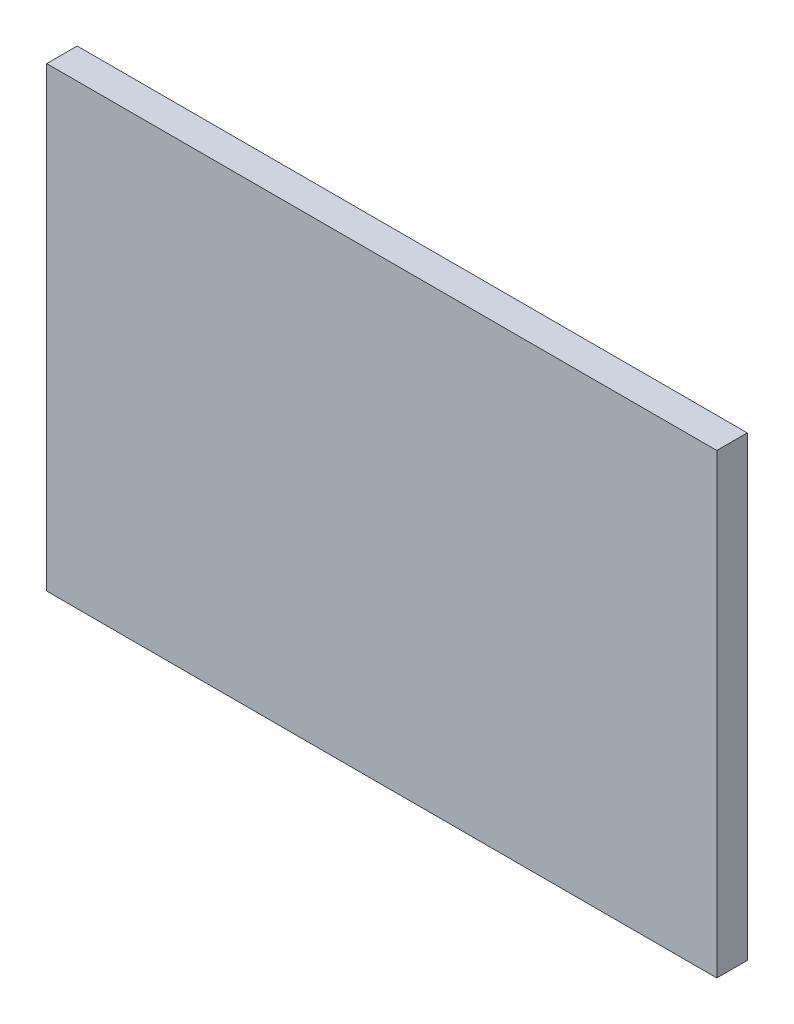
ISO-10303-21;
HEADER;
FILE_DESCRIPTION(('STEP AP214'),'2;1');
FILE_NAME('part.step','',(''),(''),'','','');
FILE_SCHEMA(('AUTOMOTIVE_DESIGN { 1 0 10303 214 1 1 1 1 }'));
ENDSEC;
DATA;
#1=APPLICATION_CONTEXT('core data for automotive mechanical design processes');
#2=APPLICATION_PROTOCOL_DEFINITION('international standard','automotive_design',2000,#1);
#3=PRODUCT_CONTEXT('',#1,'mechanical');
#4=PRODUCT('Part','Part','',(#3));
#5=PRODUCT_RELATED_PRODUCT_CATEGORY('part','',(#4));
#6=PRODUCT_DEFINITION_FORMATION('','',#4);
#7=PRODUCT_DEFINITION_CONTEXT('part definition',#1,'design');
#8=PRODUCT_DEFINITION('design','',#6,#7);
#9=PRODUCT_DEFINITION_SHAPE('','',#8);
#10=(LENGTH_UNIT() NAMED_UNIT(*) SI_UNIT(.MILLI.,.METRE.));
#11=(NAMED_UNIT(*) PLANE_ANGLE_UNIT() SI_UNIT($,.RADIAN.));
#12=(NAMED_UNIT(*) SI_UNIT($,.STERADIAN.) SOLID_ANGLE_UNIT());
#13=UNCERTAINTY_MEASURE_WITH_UNIT(LENGTH_MEASURE(1.E-05),#10,'distance_accuracy_value','');
#14=(GEOMETRIC_REPRESENTATION_CONTEXT(3) GLOBAL_UNCERTAINTY_ASSIGNED_CONTEXT((#13)) GLOBAL_UNIT_ASSIGNED_CONTEXT((#10,
#11,#12)) REPRESENTATION_CONTEXT('',''));
#15=CARTESIAN_POINT('',(0.,0.,0.));
#16=DIRECTION('',(0.,0.,1.));
#17=DIRECTION('',(1.,0.,0.));
#18=AXIS2_PLACEMENT_3D('',#15,#16,#17);
#19=CARTESIAN_POINT('',(15446.9936196928,15869.1368853616,1000.));
#20=DIRECTION('',(1.,0.,0.));
#21=DIRECTION('',(0.,0.,-1.));
#22=AXIS2_PLACEMENT_3D('',#19,#20,#21);
#23=PLANE('',#22);
#24=DIRECTION('',(0.,-1.,0.));
#25=VECTOR('',#24,1.);
#26=CARTESIAN_POINT('',(15446.9936196928,15869.1368853616,0.));
#27=LINE('',#26,#25);
#28=CARTESIAN_POINT('',(15446.9936196928,15869.1368853616,0.));
#29=VERTEX_POINT('',#28);
#30=CARTESIAN_POINT('',(15446.9936196928,869.136885361596,0.));
#31=VERTEX_POINT('',#30);
#32=EDGE_CURVE('E100',#29,#31,#27,.T.);
#33=ORIENTED_EDGE('',*,*,#32,.T.);
#34=DIRECTION('',(0.,0.,-1.));
#35=VECTOR('',#34,1.);
#36=CARTESIAN_POINT('',(15446.9936196928,869.136885361596,1000.));
#37=LINE('',#36,#35);
#38=CARTESIAN_POINT('',(15446.9936196928,869.136885361596,1000.));
#39=VERTEX_POINT('',#38);
#40=EDGE_CURVE('E11',#39,#31,#37,.T.);
#41=ORIENTED_EDGE('',*,*,#40,.F.);
#42=DIRECTION('',(0.,-1.,0.));
#43=VECTOR('',#42,1.);
#44=CARTESIAN_POINT('',(15446.9936196928,15869.1368853616,1000.));
#45=LINE('',#44,#43);
#46=CARTESIAN_POINT('',(15446.9936196928,15869.1368853616,1000.));
#47=VERTEX_POINT('',#46);
#48=EDGE_CURVE('E86',#47,#39,#45,.T.);
#49=ORIENTED_EDGE('',*,*,#48,.F.);
#50=DIRECTION('',(0.,0.,-1.));
#51=VECTOR('',#50,1.);
#52=CARTESIAN_POINT('',(15446.9936196928,15869.1368853616,1000.));
#53=LINE('',#52,#51);
#54=EDGE_CURVE('E53',#47,#29,#53,.T.);
#55=ORIENTED_EDGE('',*,*,#54,.T.);
#56=EDGE_LOOP('',(#33,#41,#49,#55));
#57=FACE_BOUND('',#56,.T.);
#58=ADVANCED_FACE('F37',(#57),#23,.F.);
#59=CARTESIAN_POINT('',(15446.9936196928,869.136885361596,1000.));
#60=DIRECTION('',(0.,1.,0.));
#61=DIRECTION('',(0.,0.,1.));
#62=AXIS2_PLACEMENT_3D('',#59,#60,#61);
#63=PLANE('',#62);
#64=DIRECTION('',(1.,0.,0.));
#65=VECTOR('',#64,1.);
#66=CARTESIAN_POINT('',(15446.9936196928,869.136885361596,0.));
#67=LINE('',#66,#65);
#68=CARTESIAN_POINT('',(37446.9936196928,869.136885361596,0.));
#69=VERTEX_POINT('',#68);
#70=EDGE_CURVE('E91',#31,#69,#67,.T.);
#71=ORIENTED_EDGE('',*,*,#70,.T.);
#72=DIRECTION('',(0.,0.,-1.));
#73=VECTOR('',#72,1.);
#74=CARTESIAN_POINT('',(37446.9936196928,869.136885361596,1000.));
#75=LINE('',#74,#73);
#76=CARTESIAN_POINT('',(37446.9936196928,869.136885361596,1000.));
#77=VERTEX_POINT('',#76);
#78=EDGE_CURVE('E45',#77,#69,#75,.T.);
#79=ORIENTED_EDGE('',*,*,#78,.F.);
#80=DIRECTION('',(1.,0.,0.));
#81=VECTOR('',#80,1.);
#82=CARTESIAN_POINT('',(15446.9936196928,869.136885361596,1000.));
#83=LINE('',#82,#81);
#84=EDGE_CURVE('E78',#39,#77,#83,.T.);
#85=ORIENTED_EDGE('',*,*,#84,.F.);
#86=ORIENTED_EDGE('',*,*,#40,.T.);
#87=EDGE_LOOP('',(#71,#79,#85,#86));
#88=FACE_BOUND('',#87,.T.);
#89=ADVANCED_FACE('F90',(#88),#63,.F.);
#90=CARTESIAN_POINT('',(37446.9936196928,15869.1368853616,1000.));
#91=DIRECTION('',(1.,0.,0.));
#92=DIRECTION('',(0.,0.,-1.));
#93=AXIS2_PLACEMENT_3D('',#90,#91,#92);
#94=PLANE('',#93);
#95=DIRECTION('',(0.,-1.,0.));
#96=VECTOR('',#95,1.);
#97=CARTESIAN_POINT('',(37446.9936196928,15869.1368853616,0.));
#98=LINE('',#97,#96);
#99=CARTESIAN_POINT('',(37446.9936196928,15869.1368853616,0.));
#100=VERTEX_POINT('',#99);
#101=EDGE_CURVE('E103',#100,#69,#98,.T.);
#102=ORIENTED_EDGE('',*,*,#101,.F.);
#103=DIRECTION('',(0.,0.,-1.));
#104=VECTOR('',#103,1.);
#105=CARTESIAN_POINT('',(37446.9936196928,15869.1368853616,1000.));
#106=LINE('',#105,#104);
#107=CARTESIAN_POINT('',(37446.9936196928,15869.1368853616,1000.));
#108=VERTEX_POINT('',#107);
#109=EDGE_CURVE('E67',#108,#100,#106,.T.);
#110=ORIENTED_EDGE('',*,*,#109,.F.);
#111=DIRECTION('',(0.,-1.,0.));
#112=VECTOR('',#111,1.);
#113=CARTESIAN_POINT('',(37446.9936196928,15869.1368853616,1000.));
#114=LINE('',#113,#112);
#115=EDGE_CURVE('E85',#108,#77,#114,.T.);
#116=ORIENTED_EDGE('',*,*,#115,.T.);
#117=ORIENTED_EDGE('',*,*,#78,.T.);
#118=EDGE_LOOP('',(#102,#110,#116,#117));
#119=FACE_BOUND('',#118,.T.);
#120=ADVANCED_FACE('F94',(#119),#94,.T.);
#121=CARTESIAN_POINT('',(15446.9936196928,15869.1368853616,1000.));
#122=DIRECTION('',(0.,1.,0.));
#123=DIRECTION('',(0.,0.,1.));
#124=AXIS2_PLACEMENT_3D('',#121,#122,#123);
#125=PLANE('',#124);
#126=DIRECTION('',(1.,0.,0.));
#127=VECTOR('',#126,1.);
#128=CARTESIAN_POINT('',(15446.9936196928,15869.1368853616,0.));
#129=LINE('',#128,#127);
#130=EDGE_CURVE('E105',#29,#100,#129,.T.);
#131=ORIENTED_EDGE('',*,*,#130,.F.);
#132=ORIENTED_EDGE('',*,*,#54,.F.);
#133=DIRECTION('',(1.,0.,0.));
#134=VECTOR('',#133,1.);
#135=CARTESIAN_POINT('',(15446.9936196928,15869.1368853616,1000.));
#136=LINE('',#135,#134);
#137=EDGE_CURVE('E95',#47,#108,#136,.T.);
#138=ORIENTED_EDGE('',*,*,#137,.T.);
#139=ORIENTED_EDGE('',*,*,#109,.T.);
#140=EDGE_LOOP('',(#131,#132,#138,#139));
#141=FACE_BOUND('',#140,.T.);
#142=ADVANCED_FACE('F111',(#141),#125,.T.);
#143=CARTESIAN_POINT('',(0.,0.,1000.));
#144=DIRECTION('',(0.,0.,1.));
#145=DIRECTION('',(1.,0.,0.));
#146=AXIS2_PLACEMENT_3D('',#143,#144,#145);
#147=PLANE('',#146);
#148=ORIENTED_EDGE('',*,*,#48,.T.);
#149=ORIENTED_EDGE('',*,*,#84,.T.);
#150=ORIENTED_EDGE('',*,*,#115,.F.);
#151=ORIENTED_EDGE('',*,*,#137,.F.);
#152=EDGE_LOOP('',(#148,#149,#150,#151));
#153=FACE_BOUND('',#152,.T.);
#154=ADVANCED_FACE('F82',(#153),#147,.T.);
#155=CARTESIAN_POINT('',(0.,0.,0.));
#156=DIRECTION('',(0.,0.,1.));
#157=DIRECTION('',(1.,0.,0.));
#158=AXIS2_PLACEMENT_3D('',#155,#156,#157);
#159=PLANE('',#158);
#160=ORIENTED_EDGE('',*,*,#32,.F.);
#161=ORIENTED_EDGE('',*,*,#130,.T.);
#162=ORIENTED_EDGE('',*,*,#101,.T.);
#163=ORIENTED_EDGE('',*,*,#70,.F.);
#164=EDGE_LOOP('',(#160,#161,#162,#163));
#165=FACE_BOUND('',#164,.T.);
#166=ADVANCED_FACE('F110',(#165),#159,.F.);
#167=CLOSED_SHELL('',(#58,#89,#120,#142,#154,#166));
#168=MANIFOLD_SOLID_BREP('B2',#167);
#169=ADVANCED_BREP_SHAPE_REPRESENTATION('',(#18,#168),#14);
#170=SHAPE_DEFINITION_REPRESENTATION(#9,#169);
ENDSEC;
END-ISO-10303-21;
